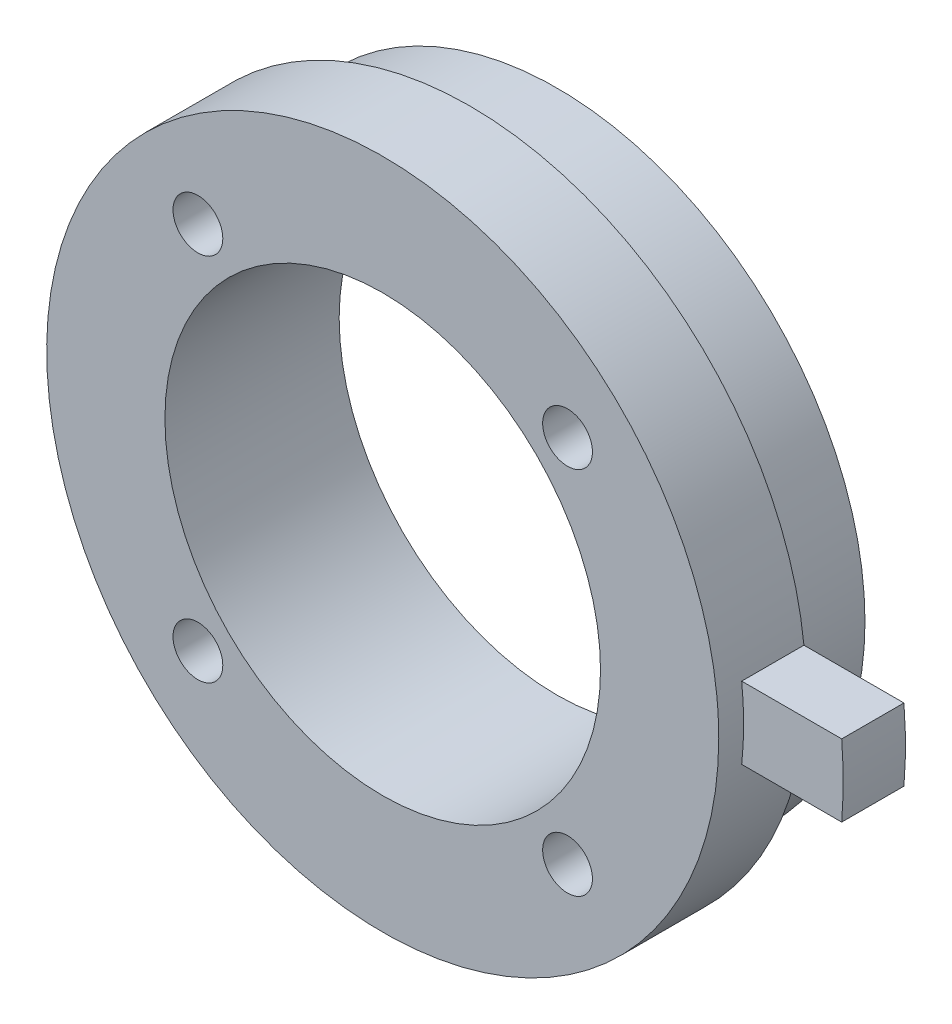
ISO-10303-21;
HEADER;
FILE_DESCRIPTION(('STEP AP214'),'2;1');
FILE_NAME('part.step','',(''),(''),'','','');
FILE_SCHEMA(('AUTOMOTIVE_DESIGN { 1 0 10303 214 1 1 1 1 }'));
ENDSEC;
DATA;
#1=APPLICATION_CONTEXT('core data for automotive mechanical design processes');
#2=APPLICATION_PROTOCOL_DEFINITION('international standard','automotive_design',2000,#1);
#3=PRODUCT_CONTEXT('',#1,'mechanical');
#4=PRODUCT('Part','Part','',(#3));
#5=PRODUCT_RELATED_PRODUCT_CATEGORY('part','',(#4));
#6=PRODUCT_DEFINITION_FORMATION('','',#4);
#7=PRODUCT_DEFINITION_CONTEXT('part definition',#1,'design');
#8=PRODUCT_DEFINITION('design','',#6,#7);
#9=PRODUCT_DEFINITION_SHAPE('','',#8);
#10=(LENGTH_UNIT() NAMED_UNIT(*) SI_UNIT(.MILLI.,.METRE.));
#11=(NAMED_UNIT(*) PLANE_ANGLE_UNIT() SI_UNIT($,.RADIAN.));
#12=(NAMED_UNIT(*) SI_UNIT($,.STERADIAN.) SOLID_ANGLE_UNIT());
#13=UNCERTAINTY_MEASURE_WITH_UNIT(LENGTH_MEASURE(1.E-05),#10,'distance_accuracy_value','');
#14=(GEOMETRIC_REPRESENTATION_CONTEXT(3) GLOBAL_UNCERTAINTY_ASSIGNED_CONTEXT((#13)) GLOBAL_UNIT_ASSIGNED_CONTEXT((#10,
#11,#12)) REPRESENTATION_CONTEXT('',''));
#15=CARTESIAN_POINT('',(0.,0.,0.));
#16=DIRECTION('',(0.,0.,1.));
#17=DIRECTION('',(1.,0.,0.));
#18=AXIS2_PLACEMENT_3D('',#15,#16,#17);
#19=CARTESIAN_POINT('',(0.,0.,10.5));
#20=DIRECTION('',(0.,0.,-1.));
#21=DIRECTION('',(-1.,0.,0.));
#22=AXIS2_PLACEMENT_3D('',#19,#20,#21);
#23=CYLINDRICAL_SURFACE('',#22,27.);
#24=CARTESIAN_POINT('',(0.,0.,10.5));
#25=DIRECTION('',(0.,0.,1.));
#26=DIRECTION('',(1.,0.,0.));
#27=AXIS2_PLACEMENT_3D('',#24,#25,#26);
#28=CIRCLE('',#27,27.);
#29=CARTESIAN_POINT('',(27.,0.,10.5));
#30=VERTEX_POINT('',#29);
#31=EDGE_CURVE('E128',#30,#30,#28,.T.);
#32=ORIENTED_EDGE('',*,*,#31,.F.);
#33=EDGE_LOOP('',(#32));
#34=FACE_BOUND('',#33,.T.);
#35=DIRECTION('',(0.,0.,-1.));
#36=VECTOR('',#35,1.);
#37=CARTESIAN_POINT('',(26.8442304191553,2.89608238889963,10.5));
#38=LINE('',#37,#36);
#39=CARTESIAN_POINT('',(26.8442304191553,2.89608238889963,3.5));
#40=VERTEX_POINT('',#39);
#41=CARTESIAN_POINT('',(26.8442304191553,2.89608238889963,8.5));
#42=VERTEX_POINT('',#41);
#43=EDGE_CURVE('E11',#40,#42,#38,.F.);
#44=ORIENTED_EDGE('',*,*,#43,.F.);
#45=CARTESIAN_POINT('',(0.,0.,3.5));
#46=DIRECTION('',(0.,0.,1.));
#47=DIRECTION('',(1.,0.,0.));
#48=AXIS2_PLACEMENT_3D('',#45,#46,#47);
#49=CIRCLE('',#48,27.);
#50=CARTESIAN_POINT('',(26.8442304191554,-2.89608238889944,3.5));
#51=VERTEX_POINT('',#50);
#52=EDGE_CURVE('E65',#40,#51,#49,.T.);
#53=ORIENTED_EDGE('',*,*,#52,.T.);
#54=DIRECTION('',(0.,0.,-1.));
#55=VECTOR('',#54,1.);
#56=CARTESIAN_POINT('',(26.8442304191554,-2.89608238889944,10.5));
#57=LINE('',#56,#55);
#58=CARTESIAN_POINT('',(26.8442304191554,-2.89608238889944,8.5));
#59=VERTEX_POINT('',#58);
#60=EDGE_CURVE('E51',#51,#59,#57,.F.);
#61=ORIENTED_EDGE('',*,*,#60,.T.);
#62=CARTESIAN_POINT('',(0.,0.,8.5));
#63=DIRECTION('',(0.,0.,-1.));
#64=DIRECTION('',(-1.,0.,0.));
#65=AXIS2_PLACEMENT_3D('',#62,#63,#64);
#66=CIRCLE('',#65,27.);
#67=EDGE_CURVE('E59',#42,#59,#66,.T.);
#68=ORIENTED_EDGE('',*,*,#67,.F.);
#69=EDGE_LOOP('',(#44,#53,#61,#68));
#70=FACE_BOUND('',#69,.T.);
#71=ADVANCED_FACE('F43',(#34,#70),#23,.T.);
#72=CARTESIAN_POINT('',(0.,0.,-3.5));
#73=DIRECTION('',(0.,0.,1.));
#74=DIRECTION('',(1.,0.,0.));
#75=AXIS2_PLACEMENT_3D('',#72,#73,#74);
#76=PLANE('',#75);
#77=CARTESIAN_POINT('',(14.8492424049175,14.8492424049175,-3.5));
#78=DIRECTION('',(0.,0.,-1.));
#79=DIRECTION('',(-1.,0.,0.));
#80=AXIS2_PLACEMENT_3D('',#77,#78,#79);
#81=CIRCLE('',#80,2.);
#82=CARTESIAN_POINT('',(12.8492424049175,14.8492424049175,-3.5));
#83=VERTEX_POINT('',#82);
#84=EDGE_CURVE('E115',#83,#83,#81,.T.);
#85=ORIENTED_EDGE('',*,*,#84,.F.);
#86=EDGE_LOOP('',(#85));
#87=FACE_BOUND('',#86,.T.);
#88=CARTESIAN_POINT('',(14.8492424049175,-14.8492424049175,-3.5));
#89=DIRECTION('',(0.,0.,-1.));
#90=DIRECTION('',(-1.,0.,0.));
#91=AXIS2_PLACEMENT_3D('',#88,#89,#90);
#92=CIRCLE('',#91,2.);
#93=CARTESIAN_POINT('',(12.8492424049175,-14.8492424049175,-3.5));
#94=VERTEX_POINT('',#93);
#95=EDGE_CURVE('E116',#94,#94,#92,.T.);
#96=ORIENTED_EDGE('',*,*,#95,.F.);
#97=EDGE_LOOP('',(#96));
#98=FACE_BOUND('',#97,.T.);
#99=CARTESIAN_POINT('',(-14.8492424049175,-14.8492424049175,-3.5));
#100=DIRECTION('',(0.,0.,-1.));
#101=DIRECTION('',(-1.,0.,0.));
#102=AXIS2_PLACEMENT_3D('',#99,#100,#101);
#103=CIRCLE('',#102,2.);
#104=CARTESIAN_POINT('',(-16.8492424049175,-14.8492424049175,-3.5));
#105=VERTEX_POINT('',#104);
#106=EDGE_CURVE('E111',#105,#105,#103,.T.);
#107=ORIENTED_EDGE('',*,*,#106,.F.);
#108=EDGE_LOOP('',(#107));
#109=FACE_BOUND('',#108,.T.);
#110=CARTESIAN_POINT('',(-14.8492424049175,14.8492424049175,-3.5));
#111=DIRECTION('',(0.,0.,-1.));
#112=DIRECTION('',(-1.,0.,0.));
#113=AXIS2_PLACEMENT_3D('',#110,#111,#112);
#114=CIRCLE('',#113,2.00000000000001);
#115=CARTESIAN_POINT('',(-16.8492424049175,14.8492424049175,-3.5));
#116=VERTEX_POINT('',#115);
#117=EDGE_CURVE('E120',#116,#116,#114,.T.);
#118=ORIENTED_EDGE('',*,*,#117,.F.);
#119=EDGE_LOOP('',(#118));
#120=FACE_BOUND('',#119,.T.);
#121=CARTESIAN_POINT('',(0.,0.,-3.5));
#122=DIRECTION('',(0.,0.,1.));
#123=DIRECTION('',(1.,0.,0.));
#124=AXIS2_PLACEMENT_3D('',#121,#122,#123);
#125=CIRCLE('',#124,24.75);
#126=CARTESIAN_POINT('',(24.75,0.,-3.5));
#127=VERTEX_POINT('',#126);
#128=EDGE_CURVE('E136',#127,#127,#125,.T.);
#129=ORIENTED_EDGE('',*,*,#128,.F.);
#130=EDGE_LOOP('',(#129));
#131=FACE_BOUND('',#130,.T.);
#132=CARTESIAN_POINT('',(0.,0.,-3.5));
#133=DIRECTION('',(0.,0.,1.));
#134=DIRECTION('',(1.,0.,0.));
#135=AXIS2_PLACEMENT_3D('',#132,#133,#134);
#136=CIRCLE('',#135,17.5);
#137=CARTESIAN_POINT('',(17.5,0.,-3.5));
#138=VERTEX_POINT('',#137);
#139=EDGE_CURVE('E131',#138,#138,#136,.T.);
#140=ORIENTED_EDGE('',*,*,#139,.T.);
#141=EDGE_LOOP('',(#140));
#142=FACE_BOUND('',#141,.T.);
#143=ADVANCED_FACE('F176',(#87,#98,#109,#120,#131,#142),#76,.F.);
#144=CARTESIAN_POINT('',(0.,0.,3.5));
#145=DIRECTION('',(0.,0.,-1.));
#146=DIRECTION('',(-1.,0.,0.));
#147=AXIS2_PLACEMENT_3D('',#144,#145,#146);
#148=CYLINDRICAL_SURFACE('',#147,24.75);
#149=CARTESIAN_POINT('',(0.,0.,3.5));
#150=DIRECTION('',(0.,0.,1.));
#151=DIRECTION('',(1.,0.,0.));
#152=AXIS2_PLACEMENT_3D('',#149,#150,#151);
#153=CIRCLE('',#152,24.75);
#154=CARTESIAN_POINT('',(24.75,0.,3.5));
#155=VERTEX_POINT('',#154);
#156=EDGE_CURVE('E140',#155,#155,#153,.T.);
#157=ORIENTED_EDGE('',*,*,#156,.F.);
#158=EDGE_LOOP('',(#157));
#159=FACE_BOUND('',#158,.T.);
#160=ORIENTED_EDGE('',*,*,#128,.T.);
#161=EDGE_LOOP('',(#160));
#162=FACE_BOUND('',#161,.T.);
#163=ADVANCED_FACE('F44',(#159,#162),#148,.T.);
#164=CARTESIAN_POINT('',(0.,0.,3.5));
#165=DIRECTION('',(0.,0.,-1.));
#166=DIRECTION('',(-1.,0.,0.));
#167=AXIS2_PLACEMENT_3D('',#164,#165,#166);
#168=CYLINDRICAL_SURFACE('',#167,17.5);
#169=ORIENTED_EDGE('',*,*,#139,.F.);
#170=EDGE_LOOP('',(#169));
#171=FACE_BOUND('',#170,.T.);
#172=CARTESIAN_POINT('',(0.,0.,10.5));
#173=DIRECTION('',(0.,0.,1.));
#174=DIRECTION('',(1.,0.,0.));
#175=AXIS2_PLACEMENT_3D('',#172,#173,#174);
#176=CIRCLE('',#175,17.5);
#177=CARTESIAN_POINT('',(17.5,0.,10.5));
#178=VERTEX_POINT('',#177);
#179=EDGE_CURVE('E127',#178,#178,#176,.T.);
#180=ORIENTED_EDGE('',*,*,#179,.T.);
#181=EDGE_LOOP('',(#180));
#182=FACE_BOUND('',#181,.T.);
#183=ADVANCED_FACE('F175',(#171,#182),#168,.F.);
#184=CARTESIAN_POINT('',(0.,0.,10.5));
#185=DIRECTION('',(0.,0.,1.));
#186=DIRECTION('',(1.,0.,0.));
#187=AXIS2_PLACEMENT_3D('',#184,#185,#186);
#188=PLANE('',#187);
#189=CARTESIAN_POINT('',(14.8492424049175,14.8492424049175,10.5));
#190=DIRECTION('',(0.,0.,1.));
#191=DIRECTION('',(1.,0.,0.));
#192=AXIS2_PLACEMENT_3D('',#189,#190,#191);
#193=CIRCLE('',#192,2.);
#194=CARTESIAN_POINT('',(16.8492424049175,14.8492424049175,10.5));
#195=VERTEX_POINT('',#194);
#196=EDGE_CURVE('E129',#195,#195,#193,.T.);
#197=ORIENTED_EDGE('',*,*,#196,.F.);
#198=EDGE_LOOP('',(#197));
#199=FACE_BOUND('',#198,.T.);
#200=CARTESIAN_POINT('',(14.8492424049175,-14.8492424049175,10.5));
#201=DIRECTION('',(0.,0.,1.));
#202=DIRECTION('',(1.,0.,0.));
#203=AXIS2_PLACEMENT_3D('',#200,#201,#202);
#204=CIRCLE('',#203,2.);
#205=CARTESIAN_POINT('',(16.8492424049175,-14.8492424049175,10.5));
#206=VERTEX_POINT('',#205);
#207=EDGE_CURVE('E146',#206,#206,#204,.T.);
#208=ORIENTED_EDGE('',*,*,#207,.F.);
#209=EDGE_LOOP('',(#208));
#210=FACE_BOUND('',#209,.T.);
#211=CARTESIAN_POINT('',(-14.8492424049175,-14.8492424049175,10.5));
#212=DIRECTION('',(0.,0.,1.));
#213=DIRECTION('',(1.,0.,0.));
#214=AXIS2_PLACEMENT_3D('',#211,#212,#213);
#215=CIRCLE('',#214,2.);
#216=CARTESIAN_POINT('',(-12.8492424049175,-14.8492424049175,10.5));
#217=VERTEX_POINT('',#216);
#218=EDGE_CURVE('E144',#217,#217,#215,.T.);
#219=ORIENTED_EDGE('',*,*,#218,.F.);
#220=EDGE_LOOP('',(#219));
#221=FACE_BOUND('',#220,.T.);
#222=CARTESIAN_POINT('',(-14.8492424049175,14.8492424049175,10.5));
#223=DIRECTION('',(0.,0.,1.));
#224=DIRECTION('',(1.,0.,0.));
#225=AXIS2_PLACEMENT_3D('',#222,#223,#224);
#226=CIRCLE('',#225,2.00000000000001);
#227=CARTESIAN_POINT('',(-12.8492424049175,14.8492424049175,10.5));
#228=VERTEX_POINT('',#227);
#229=EDGE_CURVE('E122',#228,#228,#226,.T.);
#230=ORIENTED_EDGE('',*,*,#229,.F.);
#231=EDGE_LOOP('',(#230));
#232=FACE_BOUND('',#231,.T.);
#233=ORIENTED_EDGE('',*,*,#31,.T.);
#234=EDGE_LOOP('',(#233));
#235=FACE_BOUND('',#234,.T.);
#236=ORIENTED_EDGE('',*,*,#179,.F.);
#237=EDGE_LOOP('',(#236));
#238=FACE_BOUND('',#237,.T.);
#239=ADVANCED_FACE('F159',(#199,#210,#221,#232,#235,#238),#188,.T.);
#240=CARTESIAN_POINT('',(0.,0.,3.5));
#241=DIRECTION('',(0.,0.,1.));
#242=DIRECTION('',(1.,0.,0.));
#243=AXIS2_PLACEMENT_3D('',#240,#241,#242);
#244=PLANE('',#243);
#245=ORIENTED_EDGE('',*,*,#156,.T.);
#246=EDGE_LOOP('',(#245));
#247=FACE_BOUND('',#246,.T.);
#248=ORIENTED_EDGE('',*,*,#52,.F.);
#249=DIRECTION('',(-1.,0.,0.));
#250=VECTOR('',#249,1.);
#251=CARTESIAN_POINT('',(0.,2.89608238889963,3.5));
#252=LINE('',#251,#250);
#253=CARTESIAN_POINT('',(34.8799757281553,2.89608238889963,3.5));
#254=VERTEX_POINT('',#253);
#255=EDGE_CURVE('E110',#254,#40,#252,.T.);
#256=ORIENTED_EDGE('',*,*,#255,.F.);
#257=CARTESIAN_POINT('',(0.,0.,3.5));
#258=DIRECTION('',(0.,0.,-1.));
#259=DIRECTION('',(-1.,0.,0.));
#260=AXIS2_PLACEMENT_3D('',#257,#258,#259);
#261=CIRCLE('',#260,35.);
#262=CARTESIAN_POINT('',(34.8799757281554,-2.89608238889944,3.5));
#263=VERTEX_POINT('',#262);
#264=EDGE_CURVE('E86',#254,#263,#261,.T.);
#265=ORIENTED_EDGE('',*,*,#264,.T.);
#266=DIRECTION('',(-1.,0.,0.));
#267=VECTOR('',#266,1.);
#268=CARTESIAN_POINT('',(0.,-2.89608238889944,3.5));
#269=LINE('',#268,#267);
#270=EDGE_CURVE('E97',#263,#51,#269,.T.);
#271=ORIENTED_EDGE('',*,*,#270,.T.);
#272=EDGE_LOOP('',(#248,#256,#265,#271));
#273=FACE_BOUND('',#272,.T.);
#274=ADVANCED_FACE('F160',(#247,#273),#244,.F.);
#275=CARTESIAN_POINT('',(-14.8492424049175,14.8492424049175,11.5));
#276=DIRECTION('',(0.,0.,-1.));
#277=DIRECTION('',(-1.,0.,0.));
#278=AXIS2_PLACEMENT_3D('',#275,#276,#277);
#279=CYLINDRICAL_SURFACE('',#278,2.00000000000001);
#280=ORIENTED_EDGE('',*,*,#229,.T.);
#281=EDGE_LOOP('',(#280));
#282=FACE_BOUND('',#281,.T.);
#283=ORIENTED_EDGE('',*,*,#117,.T.);
#284=EDGE_LOOP('',(#283));
#285=FACE_BOUND('',#284,.T.);
#286=ADVANCED_FACE('F157',(#282,#285),#279,.F.);
#287=CARTESIAN_POINT('',(-14.8492424049175,-14.8492424049175,11.5));
#288=DIRECTION('',(0.,0.,-1.));
#289=DIRECTION('',(-1.,0.,0.));
#290=AXIS2_PLACEMENT_3D('',#287,#288,#289);
#291=CYLINDRICAL_SURFACE('',#290,2.);
#292=ORIENTED_EDGE('',*,*,#218,.T.);
#293=EDGE_LOOP('',(#292));
#294=FACE_BOUND('',#293,.T.);
#295=ORIENTED_EDGE('',*,*,#106,.T.);
#296=EDGE_LOOP('',(#295));
#297=FACE_BOUND('',#296,.T.);
#298=ADVANCED_FACE('F169',(#294,#297),#291,.F.);
#299=CARTESIAN_POINT('',(14.8492424049175,-14.8492424049175,11.5));
#300=DIRECTION('',(0.,0.,-1.));
#301=DIRECTION('',(-1.,0.,0.));
#302=AXIS2_PLACEMENT_3D('',#299,#300,#301);
#303=CYLINDRICAL_SURFACE('',#302,2.);
#304=ORIENTED_EDGE('',*,*,#207,.T.);
#305=EDGE_LOOP('',(#304));
#306=FACE_BOUND('',#305,.T.);
#307=ORIENTED_EDGE('',*,*,#95,.T.);
#308=EDGE_LOOP('',(#307));
#309=FACE_BOUND('',#308,.T.);
#310=ADVANCED_FACE('F242',(#306,#309),#303,.F.);
#311=CARTESIAN_POINT('',(14.8492424049175,14.8492424049175,11.5));
#312=DIRECTION('',(0.,0.,-1.));
#313=DIRECTION('',(-1.,0.,0.));
#314=AXIS2_PLACEMENT_3D('',#311,#312,#313);
#315=CYLINDRICAL_SURFACE('',#314,2.);
#316=ORIENTED_EDGE('',*,*,#196,.T.);
#317=EDGE_LOOP('',(#316));
#318=FACE_BOUND('',#317,.T.);
#319=ORIENTED_EDGE('',*,*,#84,.T.);
#320=EDGE_LOOP('',(#319));
#321=FACE_BOUND('',#320,.T.);
#322=ADVANCED_FACE('F255',(#318,#321),#315,.F.);
#323=CARTESIAN_POINT('',(0.,2.89608238889963,8.5));
#324=DIRECTION('',(0.,-1.,0.));
#325=DIRECTION('',(0.,0.,-1.));
#326=AXIS2_PLACEMENT_3D('',#323,#324,#325);
#327=PLANE('',#326);
#328=ORIENTED_EDGE('',*,*,#255,.T.);
#329=ORIENTED_EDGE('',*,*,#43,.T.);
#330=DIRECTION('',(-1.,0.,0.));
#331=VECTOR('',#330,1.);
#332=CARTESIAN_POINT('',(0.,2.89608238889963,8.5));
#333=LINE('',#332,#331);
#334=CARTESIAN_POINT('',(34.8799757281553,2.89608238889963,8.5));
#335=VERTEX_POINT('',#334);
#336=EDGE_CURVE('E96',#335,#42,#333,.T.);
#337=ORIENTED_EDGE('',*,*,#336,.F.);
#338=DIRECTION('',(0.,0.,-1.));
#339=VECTOR('',#338,1.);
#340=CARTESIAN_POINT('',(34.8799757281553,2.89608238889963,8.5));
#341=LINE('',#340,#339);
#342=EDGE_CURVE('E81',#335,#254,#341,.T.);
#343=ORIENTED_EDGE('',*,*,#342,.T.);
#344=EDGE_LOOP('',(#328,#329,#337,#343));
#345=FACE_BOUND('',#344,.T.);
#346=ADVANCED_FACE('F100',(#345),#327,.F.);
#347=CARTESIAN_POINT('',(0.,-2.89608238889944,8.5));
#348=DIRECTION('',(0.,-1.,0.));
#349=DIRECTION('',(0.,0.,-1.));
#350=AXIS2_PLACEMENT_3D('',#347,#348,#349);
#351=PLANE('',#350);
#352=ORIENTED_EDGE('',*,*,#60,.F.);
#353=ORIENTED_EDGE('',*,*,#270,.F.);
#354=DIRECTION('',(0.,0.,-1.));
#355=VECTOR('',#354,1.);
#356=CARTESIAN_POINT('',(34.8799757281554,-2.89608238889944,8.5));
#357=LINE('',#356,#355);
#358=CARTESIAN_POINT('',(34.8799757281554,-2.89608238889944,8.5));
#359=VERTEX_POINT('',#358);
#360=EDGE_CURVE('E95',#359,#263,#357,.T.);
#361=ORIENTED_EDGE('',*,*,#360,.F.);
#362=DIRECTION('',(-1.,0.,0.));
#363=VECTOR('',#362,1.);
#364=CARTESIAN_POINT('',(0.,-2.89608238889944,8.5));
#365=LINE('',#364,#363);
#366=EDGE_CURVE('E91',#359,#59,#365,.T.);
#367=ORIENTED_EDGE('',*,*,#366,.T.);
#368=EDGE_LOOP('',(#352,#353,#361,#367));
#369=FACE_BOUND('',#368,.T.);
#370=ADVANCED_FACE('F154',(#369),#351,.T.);
#371=CARTESIAN_POINT('',(0.,0.,8.5));
#372=DIRECTION('',(0.,0.,-1.));
#373=DIRECTION('',(-1.,0.,0.));
#374=AXIS2_PLACEMENT_3D('',#371,#372,#373);
#375=CYLINDRICAL_SURFACE('',#374,35.);
#376=ORIENTED_EDGE('',*,*,#264,.F.);
#377=ORIENTED_EDGE('',*,*,#342,.F.);
#378=CARTESIAN_POINT('',(0.,0.,8.5));
#379=DIRECTION('',(0.,0.,-1.));
#380=DIRECTION('',(-1.,0.,0.));
#381=AXIS2_PLACEMENT_3D('',#378,#379,#380);
#382=CIRCLE('',#381,35.);
#383=EDGE_CURVE('E88',#335,#359,#382,.T.);
#384=ORIENTED_EDGE('',*,*,#383,.T.);
#385=ORIENTED_EDGE('',*,*,#360,.T.);
#386=EDGE_LOOP('',(#376,#377,#384,#385));
#387=FACE_BOUND('',#386,.T.);
#388=ADVANCED_FACE('F83',(#387),#375,.T.);
#389=CARTESIAN_POINT('',(0.,0.,8.5));
#390=DIRECTION('',(0.,0.,-1.));
#391=DIRECTION('',(-1.,0.,0.));
#392=AXIS2_PLACEMENT_3D('',#389,#390,#391);
#393=PLANE('',#392);
#394=ORIENTED_EDGE('',*,*,#336,.T.);
#395=ORIENTED_EDGE('',*,*,#67,.T.);
#396=ORIENTED_EDGE('',*,*,#366,.F.);
#397=ORIENTED_EDGE('',*,*,#383,.F.);
#398=EDGE_LOOP('',(#394,#395,#396,#397));
#399=FACE_BOUND('',#398,.T.);
#400=ADVANCED_FACE('F105',(#399),#393,.F.);
#401=CLOSED_SHELL('',(#71,#143,#163,#183,#239,#274,#286,#298,#310,#322,#346,#370,#388,#400));
#402=MANIFOLD_SOLID_BREP('B2',#401);
#403=ADVANCED_BREP_SHAPE_REPRESENTATION('',(#18,#402),#14);
#404=SHAPE_DEFINITION_REPRESENTATION(#9,#403);
ENDSEC;
END-ISO-10303-21;
